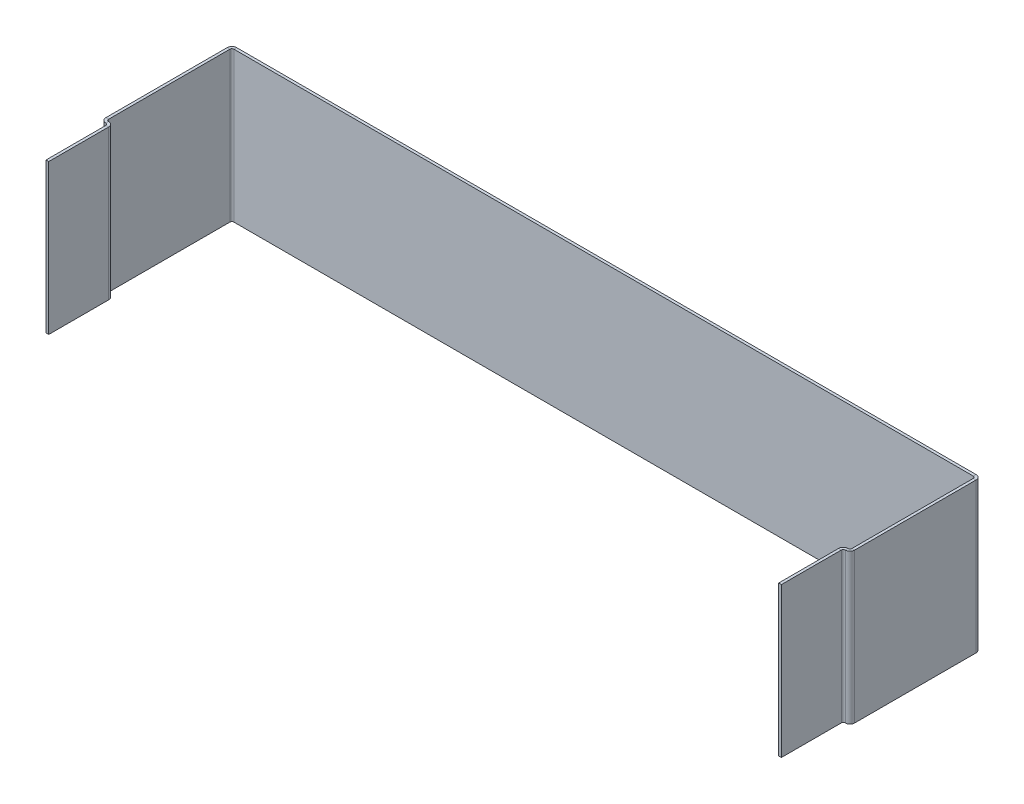
ISO-10303-21;
HEADER;
FILE_DESCRIPTION(('STEP AP214'),'2;1');
FILE_NAME('part.step','',(''),(''),'','','');
FILE_SCHEMA(('AUTOMOTIVE_DESIGN { 1 0 10303 214 1 1 1 1 }'));
ENDSEC;
DATA;
#1=APPLICATION_CONTEXT('core data for automotive mechanical design processes');
#2=APPLICATION_PROTOCOL_DEFINITION('international standard','automotive_design',2000,#1);
#3=PRODUCT_CONTEXT('',#1,'mechanical');
#4=PRODUCT('Part','Part','',(#3));
#5=PRODUCT_RELATED_PRODUCT_CATEGORY('part','',(#4));
#6=PRODUCT_DEFINITION_FORMATION('','',#4);
#7=PRODUCT_DEFINITION_CONTEXT('part definition',#1,'design');
#8=PRODUCT_DEFINITION('design','',#6,#7);
#9=PRODUCT_DEFINITION_SHAPE('','',#8);
#10=(LENGTH_UNIT() NAMED_UNIT(*) SI_UNIT(.MILLI.,.METRE.));
#11=(NAMED_UNIT(*) PLANE_ANGLE_UNIT() SI_UNIT($,.RADIAN.));
#12=(NAMED_UNIT(*) SI_UNIT($,.STERADIAN.) SOLID_ANGLE_UNIT());
#13=UNCERTAINTY_MEASURE_WITH_UNIT(LENGTH_MEASURE(1.E-05),#10,'distance_accuracy_value','');
#14=(GEOMETRIC_REPRESENTATION_CONTEXT(3) GLOBAL_UNCERTAINTY_ASSIGNED_CONTEXT((#13)) GLOBAL_UNIT_ASSIGNED_CONTEXT((#10,
#11,#12)) REPRESENTATION_CONTEXT('',''));
#15=CARTESIAN_POINT('',(0.,0.,0.));
#16=DIRECTION('',(0.,0.,1.));
#17=DIRECTION('',(1.,0.,0.));
#18=AXIS2_PLACEMENT_3D('',#15,#16,#17);
#19=CARTESIAN_POINT('',(-137.5,0.,-4.96023735913067E-13));
#20=DIRECTION('',(1.,0.,0.));
#21=DIRECTION('',(0.,0.,-1.));
#22=AXIS2_PLACEMENT_3D('',#19,#20,#21);
#23=PLANE('',#22);
#24=DIRECTION('',(0.,0.,1.));
#25=VECTOR('',#24,1.);
#26=CARTESIAN_POINT('',(-137.5,-27.5,-4.93287445609877E-13));
#27=LINE('',#26,#25);
#28=CARTESIAN_POINT('',(-137.5,-27.5,0.7366));
#29=VERTEX_POINT('',#28);
#30=CARTESIAN_POINT('',(-137.5,-27.5,45.287854329381));
#31=VERTEX_POINT('',#30);
#32=EDGE_CURVE('E471',#29,#31,#27,.T.);
#33=ORIENTED_EDGE('',*,*,#32,.T.);
#34=DIRECTION('',(0.,1.,0.));
#35=VECTOR('',#34,1.);
#36=CARTESIAN_POINT('',(-137.5,0.,45.287854329381));
#37=LINE('',#36,#35);
#38=CARTESIAN_POINT('',(-137.5,27.4999999999999,45.287854329381));
#39=VERTEX_POINT('',#38);
#40=EDGE_CURVE('E456',#31,#39,#37,.T.);
#41=ORIENTED_EDGE('',*,*,#40,.T.);
#42=DIRECTION('',(0.,0.,-1.));
#43=VECTOR('',#42,1.);
#44=CARTESIAN_POINT('',(-137.5,27.4999999999999,-4.96023735913067E-13));
#45=LINE('',#44,#43);
#46=CARTESIAN_POINT('',(-137.5,27.4999999999999,0.7366));
#47=VERTEX_POINT('',#46);
#48=EDGE_CURVE('E460',#39,#47,#45,.T.);
#49=ORIENTED_EDGE('',*,*,#48,.T.);
#50=DIRECTION('',(0.,-1.,0.));
#51=VECTOR('',#50,1.);
#52=CARTESIAN_POINT('',(-137.5,27.4999999999999,0.7366));
#53=LINE('',#52,#51);
#54=EDGE_CURVE('E436',#29,#47,#53,.F.);
#55=ORIENTED_EDGE('',*,*,#54,.F.);
#56=EDGE_LOOP('',(#33,#41,#49,#55));
#57=FACE_BOUND('',#56,.T.);
#58=ADVANCED_FACE('F63',(#57),#23,.F.);
#59=CARTESIAN_POINT('',(-137.5,-27.5,69.7366));
#60=DIRECTION('',(0.,1.,0.));
#61=DIRECTION('',(0.,0.,1.));
#62=AXIS2_PLACEMENT_3D('',#59,#60,#61);
#63=PLANE('',#62);
#64=DIRECTION('',(0.,0.,-1.));
#65=VECTOR('',#64,1.);
#66=CARTESIAN_POINT('',(-136.5,-27.5,69.7366));
#67=LINE('',#66,#65);
#68=CARTESIAN_POINT('',(-136.5,-27.5,0.736600000000004));
#69=VERTEX_POINT('',#68);
#70=CARTESIAN_POINT('',(-136.5,-27.5,45.287854329381));
#71=VERTEX_POINT('',#70);
#72=EDGE_CURVE('E450',#69,#71,#67,.F.);
#73=ORIENTED_EDGE('',*,*,#72,.T.);
#74=DIRECTION('',(-1.,0.,0.));
#75=VECTOR('',#74,1.);
#76=CARTESIAN_POINT('',(-137.5,-27.5,45.287854329381));
#77=LINE('',#76,#75);
#78=EDGE_CURVE('E459',#71,#31,#77,.T.);
#79=ORIENTED_EDGE('',*,*,#78,.T.);
#80=ORIENTED_EDGE('',*,*,#32,.F.);
#81=DIRECTION('',(1.,0.,0.));
#82=VECTOR('',#81,1.);
#83=CARTESIAN_POINT('',(-136.5,-27.5,0.736600000000004));
#84=LINE('',#83,#82);
#85=EDGE_CURVE('E442',#69,#29,#84,.F.);
#86=ORIENTED_EDGE('',*,*,#85,.F.);
#87=EDGE_LOOP('',(#73,#79,#80,#86));
#88=FACE_BOUND('',#87,.T.);
#89=ADVANCED_FACE('F512',(#88),#63,.F.);
#90=CARTESIAN_POINT('',(-137.5,27.4999999999999,0.));
#91=DIRECTION('',(0.,-1.,0.));
#92=DIRECTION('',(0.,0.,-1.));
#93=AXIS2_PLACEMENT_3D('',#90,#91,#92);
#94=PLANE('',#93);
#95=ORIENTED_EDGE('',*,*,#48,.F.);
#96=DIRECTION('',(1.,0.,0.));
#97=VECTOR('',#96,1.);
#98=CARTESIAN_POINT('',(-137.5,27.4999999999999,45.287854329381));
#99=LINE('',#98,#97);
#100=CARTESIAN_POINT('',(-136.5,27.4999999999999,45.287854329381));
#101=VERTEX_POINT('',#100);
#102=EDGE_CURVE('E464',#39,#101,#99,.T.);
#103=ORIENTED_EDGE('',*,*,#102,.T.);
#104=DIRECTION('',(0.,0.,1.));
#105=VECTOR('',#104,1.);
#106=CARTESIAN_POINT('',(-136.5,27.4999999999999,0.));
#107=LINE('',#106,#105);
#108=CARTESIAN_POINT('',(-136.5,27.4999999999999,0.736600000000004));
#109=VERTEX_POINT('',#108);
#110=EDGE_CURVE('E431',#101,#109,#107,.F.);
#111=ORIENTED_EDGE('',*,*,#110,.T.);
#112=DIRECTION('',(1.,0.,0.));
#113=VECTOR('',#112,1.);
#114=CARTESIAN_POINT('',(-137.5,27.4999999999999,0.7366));
#115=LINE('',#114,#113);
#116=EDGE_CURVE('E447',#109,#47,#115,.F.);
#117=ORIENTED_EDGE('',*,*,#116,.T.);
#118=EDGE_LOOP('',(#95,#103,#111,#117));
#119=FACE_BOUND('',#118,.T.);
#120=ADVANCED_FACE('F519',(#119),#94,.F.);
#121=CARTESIAN_POINT('',(-137.5,-27.5,-1.));
#122=DIRECTION('',(0.,-1.,0.));
#123=DIRECTION('',(1.,0.,0.));
#124=AXIS2_PLACEMENT_3D('',#121,#122,#123);
#125=PLANE('',#124);
#126=DIRECTION('',(1.,0.,0.));
#127=VECTOR('',#126,1.);
#128=CARTESIAN_POINT('',(-137.5,-27.5,0.));
#129=LINE('',#128,#127);
#130=CARTESIAN_POINT('',(-135.7634,-27.5,0.));
#131=VERTEX_POINT('',#130);
#132=CARTESIAN_POINT('',(135.7634,-27.4999999999999,0.));
#133=VERTEX_POINT('',#132);
#134=EDGE_CURVE('E411',#131,#133,#129,.T.);
#135=ORIENTED_EDGE('',*,*,#134,.F.);
#136=DIRECTION('',(0.,0.,-1.));
#137=VECTOR('',#136,1.);
#138=CARTESIAN_POINT('',(-135.7634,-27.5,0.));
#139=LINE('',#138,#137);
#140=CARTESIAN_POINT('',(-135.7634,-27.5,-0.999999999999997));
#141=VERTEX_POINT('',#140);
#142=EDGE_CURVE('E407',#131,#141,#139,.T.);
#143=ORIENTED_EDGE('',*,*,#142,.T.);
#144=DIRECTION('',(1.,0.,0.));
#145=VECTOR('',#144,1.);
#146=CARTESIAN_POINT('',(-137.5,-27.5,-1.));
#147=LINE('',#146,#145);
#148=CARTESIAN_POINT('',(135.7634,-27.4999999999999,-0.999999999999997));
#149=VERTEX_POINT('',#148);
#150=EDGE_CURVE('E418',#141,#149,#147,.T.);
#151=ORIENTED_EDGE('',*,*,#150,.T.);
#152=DIRECTION('',(0.,0.,-1.));
#153=VECTOR('',#152,1.);
#154=CARTESIAN_POINT('',(135.7634,-27.4999999999999,0.));
#155=LINE('',#154,#153);
#156=EDGE_CURVE('E282',#133,#149,#155,.T.);
#157=ORIENTED_EDGE('',*,*,#156,.F.);
#158=EDGE_LOOP('',(#135,#143,#151,#157));
#159=FACE_BOUND('',#158,.T.);
#160=ADVANCED_FACE('F548',(#159),#125,.T.);
#161=CARTESIAN_POINT('',(0.,0.,-1.));
#162=DIRECTION('',(0.,0.,-1.));
#163=DIRECTION('',(-1.,0.,0.));
#164=AXIS2_PLACEMENT_3D('',#161,#162,#163);
#165=PLANE('',#164);
#166=ORIENTED_EDGE('',*,*,#150,.F.);
#167=DIRECTION('',(0.,-1.,0.));
#168=VECTOR('',#167,1.);
#169=CARTESIAN_POINT('',(-135.7634,-27.5,-0.999999999999997));
#170=LINE('',#169,#168);
#171=CARTESIAN_POINT('',(-135.7634,27.4999999999999,-1.));
#172=VERTEX_POINT('',#171);
#173=EDGE_CURVE('E414',#141,#172,#170,.F.);
#174=ORIENTED_EDGE('',*,*,#173,.T.);
#175=DIRECTION('',(-1.,0.,0.));
#176=VECTOR('',#175,1.);
#177=CARTESIAN_POINT('',(-137.5,27.4999999999999,-1.));
#178=LINE('',#177,#176);
#179=CARTESIAN_POINT('',(135.7634,27.5,-1.));
#180=VERTEX_POINT('',#179);
#181=EDGE_CURVE('E417',#180,#172,#178,.T.);
#182=ORIENTED_EDGE('',*,*,#181,.F.);
#183=DIRECTION('',(0.,-1.,0.));
#184=VECTOR('',#183,1.);
#185=CARTESIAN_POINT('',(135.7634,-27.4999999999999,-0.999999999999997));
#186=LINE('',#185,#184);
#187=EDGE_CURVE('E288',#149,#180,#186,.F.);
#188=ORIENTED_EDGE('',*,*,#187,.F.);
#189=EDGE_LOOP('',(#166,#174,#182,#188));
#190=FACE_BOUND('',#189,.T.);
#191=ADVANCED_FACE('F530',(#190),#165,.T.);
#192=CARTESIAN_POINT('',(0.,0.,0.));
#193=DIRECTION('',(0.,0.,-1.));
#194=DIRECTION('',(-1.,0.,0.));
#195=AXIS2_PLACEMENT_3D('',#192,#193,#194);
#196=PLANE('',#195);
#197=DIRECTION('',(0.,-1.,0.));
#198=VECTOR('',#197,1.);
#199=CARTESIAN_POINT('',(-135.7634,-27.5,0.));
#200=LINE('',#199,#198);
#201=CARTESIAN_POINT('',(-135.7634,27.4999999999999,0.));
#202=VERTEX_POINT('',#201);
#203=EDGE_CURVE('E433',#131,#202,#200,.F.);
#204=ORIENTED_EDGE('',*,*,#203,.F.);
#205=ORIENTED_EDGE('',*,*,#134,.T.);
#206=DIRECTION('',(0.,-1.,0.));
#207=VECTOR('',#206,1.);
#208=CARTESIAN_POINT('',(135.7634,-27.4999999999999,0.));
#209=LINE('',#208,#207);
#210=CARTESIAN_POINT('',(135.7634,27.5,0.));
#211=VERTEX_POINT('',#210);
#212=EDGE_CURVE('E298',#133,#211,#209,.F.);
#213=ORIENTED_EDGE('',*,*,#212,.T.);
#214=DIRECTION('',(-1.,0.,0.));
#215=VECTOR('',#214,1.);
#216=CARTESIAN_POINT('',(-137.5,27.4999999999999,0.));
#217=LINE('',#216,#215);
#218=EDGE_CURVE('E413',#211,#202,#217,.T.);
#219=ORIENTED_EDGE('',*,*,#218,.T.);
#220=EDGE_LOOP('',(#204,#205,#213,#219));
#221=FACE_BOUND('',#220,.T.);
#222=ADVANCED_FACE('F557',(#221),#196,.F.);
#223=CARTESIAN_POINT('',(-137.5,27.4999999999999,-1.));
#224=DIRECTION('',(0.,1.,0.));
#225=DIRECTION('',(-1.,0.,0.));
#226=AXIS2_PLACEMENT_3D('',#223,#224,#225);
#227=PLANE('',#226);
#228=DIRECTION('',(0.,0.,-1.));
#229=VECTOR('',#228,1.);
#230=CARTESIAN_POINT('',(-135.7634,27.4999999999999,0.));
#231=LINE('',#230,#229);
#232=EDGE_CURVE('E422',#202,#172,#231,.T.);
#233=ORIENTED_EDGE('',*,*,#232,.F.);
#234=ORIENTED_EDGE('',*,*,#218,.F.);
#235=DIRECTION('',(0.,0.,-1.));
#236=VECTOR('',#235,1.);
#237=CARTESIAN_POINT('',(135.7634,27.5,0.));
#238=LINE('',#237,#236);
#239=EDGE_CURVE('E289',#211,#180,#238,.T.);
#240=ORIENTED_EDGE('',*,*,#239,.T.);
#241=ORIENTED_EDGE('',*,*,#181,.T.);
#242=EDGE_LOOP('',(#233,#234,#240,#241));
#243=FACE_BOUND('',#242,.T.);
#244=ADVANCED_FACE('F533',(#243),#227,.T.);
#245=CARTESIAN_POINT('',(-135.7634,27.4999999999999,0.736600000000006));
#246=DIRECTION('',(0.,1.,0.));
#247=DIRECTION('',(0.,0.,1.));
#248=AXIS2_PLACEMENT_3D('',#245,#246,#247);
#249=PLANE('',#248);
#250=ORIENTED_EDGE('',*,*,#116,.F.);
#251=CARTESIAN_POINT('',(-135.7634,27.4999999999999,0.736600000000006));
#252=DIRECTION('',(0.,-1.,0.));
#253=DIRECTION('',(0.,0.,-1.));
#254=AXIS2_PLACEMENT_3D('',#251,#252,#253);
#255=CIRCLE('',#254,0.736600000000004);
#256=EDGE_CURVE('E435',#202,#109,#255,.F.);
#257=ORIENTED_EDGE('',*,*,#256,.F.);
#258=ORIENTED_EDGE('',*,*,#232,.T.);
#259=CARTESIAN_POINT('',(-135.7634,27.4999999999999,0.736600000000006));
#260=DIRECTION('',(0.,-1.,0.));
#261=DIRECTION('',(0.,0.,-1.));
#262=AXIS2_PLACEMENT_3D('',#259,#260,#261);
#263=CIRCLE('',#262,1.7366);
#264=EDGE_CURVE('E427',#172,#47,#263,.F.);
#265=ORIENTED_EDGE('',*,*,#264,.T.);
#266=EDGE_LOOP('',(#250,#257,#258,#265));
#267=FACE_BOUND('',#266,.T.);
#268=ADVANCED_FACE('F524',(#267),#249,.T.);
#269=CARTESIAN_POINT('',(-135.7634,-27.5,0.736600000000006));
#270=DIRECTION('',(0.,1.,0.));
#271=DIRECTION('',(0.,0.,1.));
#272=AXIS2_PLACEMENT_3D('',#269,#270,#271);
#273=PLANE('',#272);
#274=CARTESIAN_POINT('',(-135.7634,-27.5,0.736600000000006));
#275=DIRECTION('',(0.,-1.,0.));
#276=DIRECTION('',(0.,0.,-1.));
#277=AXIS2_PLACEMENT_3D('',#274,#275,#276);
#278=CIRCLE('',#277,0.736600000000004);
#279=EDGE_CURVE('E428',#69,#131,#278,.T.);
#280=ORIENTED_EDGE('',*,*,#279,.F.);
#281=ORIENTED_EDGE('',*,*,#85,.T.);
#282=CARTESIAN_POINT('',(-135.7634,-27.5,0.736600000000006));
#283=DIRECTION('',(0.,-1.,0.));
#284=DIRECTION('',(0.,0.,-1.));
#285=AXIS2_PLACEMENT_3D('',#282,#283,#284);
#286=CIRCLE('',#285,1.7366);
#287=EDGE_CURVE('E439',#29,#141,#286,.T.);
#288=ORIENTED_EDGE('',*,*,#287,.T.);
#289=ORIENTED_EDGE('',*,*,#142,.F.);
#290=EDGE_LOOP('',(#280,#281,#288,#289));
#291=FACE_BOUND('',#290,.T.);
#292=ADVANCED_FACE('F551',(#291),#273,.F.);
#293=CARTESIAN_POINT('',(-135.7634,-27.5,0.736600000000006));
#294=DIRECTION('',(0.,-1.,0.));
#295=DIRECTION('',(-1.,0.,0.));
#296=AXIS2_PLACEMENT_3D('',#293,#294,#295);
#297=CYLINDRICAL_SURFACE('',#296,1.7366);
#298=ORIENTED_EDGE('',*,*,#173,.F.);
#299=ORIENTED_EDGE('',*,*,#287,.F.);
#300=ORIENTED_EDGE('',*,*,#54,.T.);
#301=ORIENTED_EDGE('',*,*,#264,.F.);
#302=EDGE_LOOP('',(#298,#299,#300,#301));
#303=FACE_BOUND('',#302,.T.);
#304=ADVANCED_FACE('F522',(#303),#297,.T.);
#305=CARTESIAN_POINT('',(-135.7634,-27.5,0.736600000000006));
#306=DIRECTION('',(0.,-1.,0.));
#307=DIRECTION('',(-1.,0.,0.));
#308=AXIS2_PLACEMENT_3D('',#305,#306,#307);
#309=CYLINDRICAL_SURFACE('',#308,0.736600000000004);
#310=ORIENTED_EDGE('',*,*,#203,.T.);
#311=ORIENTED_EDGE('',*,*,#256,.T.);
#312=DIRECTION('',(0.,-1.,0.));
#313=VECTOR('',#312,1.);
#314=CARTESIAN_POINT('',(-136.5,27.4999999999999,0.736600000000004));
#315=LINE('',#314,#313);
#316=EDGE_CURVE('E432',#109,#69,#315,.T.);
#317=ORIENTED_EDGE('',*,*,#316,.T.);
#318=ORIENTED_EDGE('',*,*,#279,.T.);
#319=EDGE_LOOP('',(#310,#311,#317,#318));
#320=FACE_BOUND('',#319,.T.);
#321=ADVANCED_FACE('F554',(#320),#309,.F.);
#322=CARTESIAN_POINT('',(-136.5,0.,-4.92532254574224E-13));
#323=DIRECTION('',(1.,0.,0.));
#324=DIRECTION('',(0.,0.,-1.));
#325=AXIS2_PLACEMENT_3D('',#322,#323,#324);
#326=PLANE('',#325);
#327=DIRECTION('',(0.,1.,0.));
#328=VECTOR('',#327,1.);
#329=CARTESIAN_POINT('',(-136.5,0.,45.287854329381));
#330=LINE('',#329,#328);
#331=EDGE_CURVE('E84',#71,#101,#330,.T.);
#332=ORIENTED_EDGE('',*,*,#331,.F.);
#333=ORIENTED_EDGE('',*,*,#72,.F.);
#334=ORIENTED_EDGE('',*,*,#316,.F.);
#335=ORIENTED_EDGE('',*,*,#110,.F.);
#336=EDGE_LOOP('',(#332,#333,#334,#335));
#337=FACE_BOUND('',#336,.T.);
#338=ADVANCED_FACE('F617',(#337),#326,.T.);
#339=CARTESIAN_POINT('',(-135.7634,-27.5,45.287854329381));
#340=DIRECTION('',(0.,-1.,0.));
#341=DIRECTION('',(0.,0.,-1.));
#342=AXIS2_PLACEMENT_3D('',#339,#340,#341);
#343=PLANE('',#342);
#344=ORIENTED_EDGE('',*,*,#78,.F.);
#345=CARTESIAN_POINT('',(-135.7634,-27.5,45.287854329381));
#346=DIRECTION('',(0.,1.,0.));
#347=DIRECTION('',(0.,0.,1.));
#348=AXIS2_PLACEMENT_3D('',#345,#346,#347);
#349=CIRCLE('',#348,0.7366);
#350=CARTESIAN_POINT('',(-135.7634,-27.5,46.024454329381));
#351=VERTEX_POINT('',#350);
#352=EDGE_CURVE('E396',#71,#351,#349,.T.);
#353=ORIENTED_EDGE('',*,*,#352,.T.);
#354=DIRECTION('',(0.,0.,1.));
#355=VECTOR('',#354,1.);
#356=CARTESIAN_POINT('',(-135.7634,-27.5,47.024454329381));
#357=LINE('',#356,#355);
#358=CARTESIAN_POINT('',(-135.7634,-27.5,47.024454329381));
#359=VERTEX_POINT('',#358);
#360=EDGE_CURVE('E477',#351,#359,#357,.T.);
#361=ORIENTED_EDGE('',*,*,#360,.T.);
#362=CARTESIAN_POINT('',(-135.7634,-27.5,45.287854329381));
#363=DIRECTION('',(0.,1.,0.));
#364=DIRECTION('',(0.,0.,1.));
#365=AXIS2_PLACEMENT_3D('',#362,#363,#364);
#366=CIRCLE('',#365,1.7366);
#367=EDGE_CURVE('E400',#31,#359,#366,.T.);
#368=ORIENTED_EDGE('',*,*,#367,.F.);
#369=EDGE_LOOP('',(#344,#353,#361,#368));
#370=FACE_BOUND('',#369,.T.);
#371=ADVANCED_FACE('F480',(#370),#343,.T.);
#372=CARTESIAN_POINT('',(-135.7634,27.4999999999999,45.287854329381));
#373=DIRECTION('',(0.,1.,0.));
#374=DIRECTION('',(0.,0.,1.));
#375=AXIS2_PLACEMENT_3D('',#372,#373,#374);
#376=PLANE('',#375);
#377=DIRECTION('',(0.,0.,-1.));
#378=VECTOR('',#377,1.);
#379=CARTESIAN_POINT('',(-135.7634,27.4999999999999,47.024454329381));
#380=LINE('',#379,#378);
#381=CARTESIAN_POINT('',(-135.7634,27.4999999999999,47.024454329381));
#382=VERTEX_POINT('',#381);
#383=CARTESIAN_POINT('',(-135.7634,27.4999999999999,46.024454329381));
#384=VERTEX_POINT('',#383);
#385=EDGE_CURVE('E13',#382,#384,#380,.T.);
#386=ORIENTED_EDGE('',*,*,#385,.T.);
#387=CARTESIAN_POINT('',(-135.7634,27.4999999999999,45.287854329381));
#388=DIRECTION('',(0.,1.,0.));
#389=DIRECTION('',(0.,0.,1.));
#390=AXIS2_PLACEMENT_3D('',#387,#388,#389);
#391=CIRCLE('',#390,0.7366);
#392=EDGE_CURVE('E404',#384,#101,#391,.F.);
#393=ORIENTED_EDGE('',*,*,#392,.T.);
#394=ORIENTED_EDGE('',*,*,#102,.F.);
#395=CARTESIAN_POINT('',(-135.7634,27.4999999999999,45.287854329381));
#396=DIRECTION('',(0.,-1.,0.));
#397=DIRECTION('',(0.,0.,-1.));
#398=AXIS2_PLACEMENT_3D('',#395,#396,#397);
#399=CIRCLE('',#398,1.7366);
#400=EDGE_CURVE('E403',#382,#39,#399,.T.);
#401=ORIENTED_EDGE('',*,*,#400,.F.);
#402=EDGE_LOOP('',(#386,#393,#394,#401));
#403=FACE_BOUND('',#402,.T.);
#404=ADVANCED_FACE('F517',(#403),#376,.T.);
#405=CARTESIAN_POINT('',(-135.7634,-55.043374708759,45.287854329381));
#406=DIRECTION('',(0.,1.,0.));
#407=DIRECTION('',(0.,0.,1.));
#408=AXIS2_PLACEMENT_3D('',#405,#406,#407);
#409=CYLINDRICAL_SURFACE('',#408,1.7366);
#410=ORIENTED_EDGE('',*,*,#400,.T.);
#411=ORIENTED_EDGE('',*,*,#40,.F.);
#412=ORIENTED_EDGE('',*,*,#367,.T.);
#413=DIRECTION('',(0.,1.,0.));
#414=VECTOR('',#413,1.);
#415=CARTESIAN_POINT('',(-135.7634,0.,47.024454329381));
#416=LINE('',#415,#414);
#417=EDGE_CURVE('E467',#359,#382,#416,.T.);
#418=ORIENTED_EDGE('',*,*,#417,.T.);
#419=EDGE_LOOP('',(#410,#411,#412,#418));
#420=FACE_BOUND('',#419,.T.);
#421=ADVANCED_FACE('F505',(#420),#409,.T.);
#422=CARTESIAN_POINT('',(-135.7634,-55.043374708759,45.287854329381));
#423=DIRECTION('',(0.,1.,0.));
#424=DIRECTION('',(0.,0.,1.));
#425=AXIS2_PLACEMENT_3D('',#422,#423,#424);
#426=CYLINDRICAL_SURFACE('',#425,0.7366);
#427=ORIENTED_EDGE('',*,*,#392,.F.);
#428=DIRECTION('',(0.,1.,0.));
#429=VECTOR('',#428,1.);
#430=CARTESIAN_POINT('',(-135.7634,0.,46.024454329381));
#431=LINE('',#430,#429);
#432=EDGE_CURVE('E70',#351,#384,#431,.T.);
#433=ORIENTED_EDGE('',*,*,#432,.F.);
#434=ORIENTED_EDGE('',*,*,#352,.F.);
#435=ORIENTED_EDGE('',*,*,#331,.T.);
#436=EDGE_LOOP('',(#427,#433,#434,#435));
#437=FACE_BOUND('',#436,.T.);
#438=ADVANCED_FACE('F514',(#437),#426,.F.);
#439=CARTESIAN_POINT('',(-135.7634,-27.5,47.761054329381));
#440=DIRECTION('',(0.,1.,0.));
#441=DIRECTION('',(0.,0.,1.));
#442=AXIS2_PLACEMENT_3D('',#439,#440,#441);
#443=PLANE('',#442);
#444=ORIENTED_EDGE('',*,*,#360,.F.);
#445=CARTESIAN_POINT('',(-135.7634,-27.5,47.761054329381));
#446=DIRECTION('',(0.,1.,0.));
#447=DIRECTION('',(0.,0.,1.));
#448=AXIS2_PLACEMENT_3D('',#445,#446,#447);
#449=CIRCLE('',#448,1.7366);
#450=CARTESIAN_POINT('',(-134.0268,-27.5,47.761054329381));
#451=VERTEX_POINT('',#450);
#452=EDGE_CURVE('E358',#351,#451,#449,.F.);
#453=ORIENTED_EDGE('',*,*,#452,.T.);
#454=DIRECTION('',(-1.,0.,0.));
#455=VECTOR('',#454,1.);
#456=CARTESIAN_POINT('',(-135.0268,-27.5,47.761054329381));
#457=LINE('',#456,#455);
#458=CARTESIAN_POINT('',(-135.0268,-27.5,47.761054329381));
#459=VERTEX_POINT('',#458);
#460=EDGE_CURVE('E381',#451,#459,#457,.T.);
#461=ORIENTED_EDGE('',*,*,#460,.T.);
#462=CARTESIAN_POINT('',(-135.7634,-27.5,47.761054329381));
#463=DIRECTION('',(0.,-1.,0.));
#464=DIRECTION('',(0.,0.,-1.));
#465=AXIS2_PLACEMENT_3D('',#462,#463,#464);
#466=CIRCLE('',#465,0.7366);
#467=EDGE_CURVE('E389',#359,#459,#466,.T.);
#468=ORIENTED_EDGE('',*,*,#467,.F.);
#469=EDGE_LOOP('',(#444,#453,#461,#468));
#470=FACE_BOUND('',#469,.T.);
#471=ADVANCED_FACE('F483',(#470),#443,.F.);
#472=CARTESIAN_POINT('',(-135.7634,27.4999999999999,47.761054329381));
#473=DIRECTION('',(0.,-1.,0.));
#474=DIRECTION('',(0.,0.,-1.));
#475=AXIS2_PLACEMENT_3D('',#472,#473,#474);
#476=PLANE('',#475);
#477=DIRECTION('',(1.,0.,0.));
#478=VECTOR('',#477,1.);
#479=CARTESIAN_POINT('',(-135.0268,27.4999999999999,47.761054329381));
#480=LINE('',#479,#478);
#481=CARTESIAN_POINT('',(-135.0268,27.4999999999999,47.761054329381));
#482=VERTEX_POINT('',#481);
#483=CARTESIAN_POINT('',(-134.0268,27.4999999999999,47.761054329381));
#484=VERTEX_POINT('',#483);
#485=EDGE_CURVE('E384',#482,#484,#480,.T.);
#486=ORIENTED_EDGE('',*,*,#485,.T.);
#487=CARTESIAN_POINT('',(-135.7634,27.4999999999999,47.761054329381));
#488=DIRECTION('',(0.,1.,0.));
#489=DIRECTION('',(0.,0.,1.));
#490=AXIS2_PLACEMENT_3D('',#487,#488,#489);
#491=CIRCLE('',#490,1.7366);
#492=EDGE_CURVE('E393',#484,#384,#491,.T.);
#493=ORIENTED_EDGE('',*,*,#492,.T.);
#494=ORIENTED_EDGE('',*,*,#385,.F.);
#495=CARTESIAN_POINT('',(-135.7634,27.4999999999999,47.761054329381));
#496=DIRECTION('',(0.,1.,0.));
#497=DIRECTION('',(0.,0.,1.));
#498=AXIS2_PLACEMENT_3D('',#495,#496,#497);
#499=CIRCLE('',#498,0.7366);
#500=EDGE_CURVE('E392',#482,#382,#499,.T.);
#501=ORIENTED_EDGE('',*,*,#500,.F.);
#502=EDGE_LOOP('',(#486,#493,#494,#501));
#503=FACE_BOUND('',#502,.T.);
#504=ADVANCED_FACE('F493',(#503),#476,.F.);
#505=CARTESIAN_POINT('',(-135.7634,-55.043374708759,47.761054329381));
#506=DIRECTION('',(0.,1.,0.));
#507=DIRECTION('',(0.,0.,1.));
#508=AXIS2_PLACEMENT_3D('',#505,#506,#507);
#509=CYLINDRICAL_SURFACE('',#508,0.7366);
#510=ORIENTED_EDGE('',*,*,#500,.T.);
#511=ORIENTED_EDGE('',*,*,#417,.F.);
#512=ORIENTED_EDGE('',*,*,#467,.T.);
#513=DIRECTION('',(0.,1.,0.));
#514=VECTOR('',#513,1.);
#515=CARTESIAN_POINT('',(-135.0268,0.,47.761054329381));
#516=LINE('',#515,#514);
#517=EDGE_CURVE('E355',#459,#482,#516,.T.);
#518=ORIENTED_EDGE('',*,*,#517,.T.);
#519=EDGE_LOOP('',(#510,#511,#512,#518));
#520=FACE_BOUND('',#519,.T.);
#521=ADVANCED_FACE('F502',(#520),#509,.F.);
#522=CARTESIAN_POINT('',(-135.7634,-55.043374708759,47.761054329381));
#523=DIRECTION('',(0.,1.,0.));
#524=DIRECTION('',(0.,0.,1.));
#525=AXIS2_PLACEMENT_3D('',#522,#523,#524);
#526=CYLINDRICAL_SURFACE('',#525,1.7366);
#527=ORIENTED_EDGE('',*,*,#492,.F.);
#528=DIRECTION('',(0.,1.,0.));
#529=VECTOR('',#528,1.);
#530=CARTESIAN_POINT('',(-134.0268,0.,47.761054329381));
#531=LINE('',#530,#529);
#532=EDGE_CURVE('E362',#451,#484,#531,.T.);
#533=ORIENTED_EDGE('',*,*,#532,.F.);
#534=ORIENTED_EDGE('',*,*,#452,.F.);
#535=ORIENTED_EDGE('',*,*,#432,.T.);
#536=EDGE_LOOP('',(#527,#533,#534,#535));
#537=FACE_BOUND('',#536,.T.);
#538=ADVANCED_FACE('F486',(#537),#526,.T.);
#539=CARTESIAN_POINT('',(-135.0268,27.4999999999999,69.7366));
#540=DIRECTION('',(0.,0.,-1.));
#541=DIRECTION('',(-1.,0.,0.));
#542=AXIS2_PLACEMENT_3D('',#539,#540,#541);
#543=PLANE('',#542);
#544=DIRECTION('',(0.,-1.,0.));
#545=VECTOR('',#544,1.);
#546=CARTESIAN_POINT('',(-134.0268,27.4999999999999,69.7366));
#547=LINE('',#546,#545);
#548=CARTESIAN_POINT('',(-134.0268,-27.5,69.7366));
#549=VERTEX_POINT('',#548);
#550=CARTESIAN_POINT('',(-134.0268,27.4999999999999,69.7366));
#551=VERTEX_POINT('',#550);
#552=EDGE_CURVE('E378',#549,#551,#547,.F.);
#553=ORIENTED_EDGE('',*,*,#552,.T.);
#554=DIRECTION('',(1.,0.,0.));
#555=VECTOR('',#554,1.);
#556=CARTESIAN_POINT('',(-135.0268,27.4999999999999,69.7366));
#557=LINE('',#556,#555);
#558=CARTESIAN_POINT('',(-135.0268,27.4999999999999,69.7366));
#559=VERTEX_POINT('',#558);
#560=EDGE_CURVE('E359',#559,#551,#557,.T.);
#561=ORIENTED_EDGE('',*,*,#560,.F.);
#562=DIRECTION('',(0.,1.,0.));
#563=VECTOR('',#562,1.);
#564=CARTESIAN_POINT('',(-135.0268,0.,69.7366));
#565=LINE('',#564,#563);
#566=CARTESIAN_POINT('',(-135.0268,-27.5,69.7366));
#567=VERTEX_POINT('',#566);
#568=EDGE_CURVE('E370',#567,#559,#565,.T.);
#569=ORIENTED_EDGE('',*,*,#568,.F.);
#570=DIRECTION('',(1.,0.,0.));
#571=VECTOR('',#570,1.);
#572=CARTESIAN_POINT('',(-135.0268,-27.5,69.7366));
#573=LINE('',#572,#571);
#574=EDGE_CURVE('E375',#567,#549,#573,.T.);
#575=ORIENTED_EDGE('',*,*,#574,.T.);
#576=EDGE_LOOP('',(#553,#561,#569,#575));
#577=FACE_BOUND('',#576,.T.);
#578=ADVANCED_FACE('F651',(#577),#543,.F.);
#579=CARTESIAN_POINT('',(-135.0268,0.,-1.41169347542963));
#580=DIRECTION('',(1.,0.,0.));
#581=DIRECTION('',(0.,0.,-1.));
#582=AXIS2_PLACEMENT_3D('',#579,#580,#581);
#583=PLANE('',#582);
#584=ORIENTED_EDGE('',*,*,#517,.F.);
#585=DIRECTION('',(0.,0.,1.));
#586=VECTOR('',#585,1.);
#587=CARTESIAN_POINT('',(-135.0268,-27.5,-1.4116934754296));
#588=LINE('',#587,#586);
#589=EDGE_CURVE('E373',#459,#567,#588,.T.);
#590=ORIENTED_EDGE('',*,*,#589,.T.);
#591=ORIENTED_EDGE('',*,*,#568,.T.);
#592=DIRECTION('',(0.,0.,-1.));
#593=VECTOR('',#592,1.);
#594=CARTESIAN_POINT('',(-135.0268,27.4999999999999,-1.41169347542963));
#595=LINE('',#594,#593);
#596=EDGE_CURVE('E367',#559,#482,#595,.T.);
#597=ORIENTED_EDGE('',*,*,#596,.T.);
#598=EDGE_LOOP('',(#584,#590,#591,#597));
#599=FACE_BOUND('',#598,.T.);
#600=ADVANCED_FACE('F497',(#599),#583,.F.);
#601=CARTESIAN_POINT('',(-135.0268,-27.5,68.3249065245708));
#602=DIRECTION('',(0.,1.,0.));
#603=DIRECTION('',(0.,0.,1.));
#604=AXIS2_PLACEMENT_3D('',#601,#602,#603);
#605=PLANE('',#604);
#606=ORIENTED_EDGE('',*,*,#460,.F.);
#607=DIRECTION('',(0.,0.,-1.));
#608=VECTOR('',#607,1.);
#609=CARTESIAN_POINT('',(-134.0268,-27.5,68.3249065245708));
#610=LINE('',#609,#608);
#611=EDGE_CURVE('E365',#451,#549,#610,.F.);
#612=ORIENTED_EDGE('',*,*,#611,.T.);
#613=ORIENTED_EDGE('',*,*,#574,.F.);
#614=ORIENTED_EDGE('',*,*,#589,.F.);
#615=EDGE_LOOP('',(#606,#612,#613,#614));
#616=FACE_BOUND('',#615,.T.);
#617=ADVANCED_FACE('F658',(#616),#605,.F.);
#618=CARTESIAN_POINT('',(-134.0268,0.,-1.41169347542963));
#619=DIRECTION('',(1.,0.,0.));
#620=DIRECTION('',(0.,0.,-1.));
#621=AXIS2_PLACEMENT_3D('',#618,#619,#620);
#622=PLANE('',#621);
#623=ORIENTED_EDGE('',*,*,#611,.F.);
#624=ORIENTED_EDGE('',*,*,#532,.T.);
#625=DIRECTION('',(0.,0.,1.));
#626=VECTOR('',#625,1.);
#627=CARTESIAN_POINT('',(-134.0268,27.4999999999999,-1.41169347542913));
#628=LINE('',#627,#626);
#629=EDGE_CURVE('E356',#551,#484,#628,.F.);
#630=ORIENTED_EDGE('',*,*,#629,.F.);
#631=ORIENTED_EDGE('',*,*,#552,.F.);
#632=EDGE_LOOP('',(#623,#624,#630,#631));
#633=FACE_BOUND('',#632,.T.);
#634=ADVANCED_FACE('F488',(#633),#622,.T.);
#635=CARTESIAN_POINT('',(-135.0268,27.4999999999999,-1.41169347542913));
#636=DIRECTION('',(0.,-1.,0.));
#637=DIRECTION('',(0.,0.,-1.));
#638=AXIS2_PLACEMENT_3D('',#635,#636,#637);
#639=PLANE('',#638);
#640=ORIENTED_EDGE('',*,*,#485,.F.);
#641=ORIENTED_EDGE('',*,*,#596,.F.);
#642=ORIENTED_EDGE('',*,*,#560,.T.);
#643=ORIENTED_EDGE('',*,*,#629,.T.);
#644=EDGE_LOOP('',(#640,#641,#642,#643));
#645=FACE_BOUND('',#644,.T.);
#646=ADVANCED_FACE('F495',(#645),#639,.F.);
#647=CARTESIAN_POINT('',(137.5,0.,-4.96023735913067E-13));
#648=DIRECTION('',(-1.,0.,0.));
#649=DIRECTION('',(0.,0.,-1.));
#650=AXIS2_PLACEMENT_3D('',#647,#648,#649);
#651=PLANE('',#650);
#652=DIRECTION('',(0.,0.,1.));
#653=VECTOR('',#652,1.);
#654=CARTESIAN_POINT('',(137.5,-27.4999999999999,-4.93287445609877E-13));
#655=LINE('',#654,#653);
#656=CARTESIAN_POINT('',(137.5,-27.4999999999999,0.7366));
#657=VERTEX_POINT('',#656);
#658=CARTESIAN_POINT('',(137.5,-27.4999999999999,45.287854329381));
#659=VERTEX_POINT('',#658);
#660=EDGE_CURVE('E339',#657,#659,#655,.T.);
#661=ORIENTED_EDGE('',*,*,#660,.F.);
#662=DIRECTION('',(0.,-1.,0.));
#663=VECTOR('',#662,1.);
#664=CARTESIAN_POINT('',(137.5,27.5,0.7366));
#665=LINE('',#664,#663);
#666=CARTESIAN_POINT('',(137.5,27.5,0.7366));
#667=VERTEX_POINT('',#666);
#668=EDGE_CURVE('E302',#657,#667,#665,.F.);
#669=ORIENTED_EDGE('',*,*,#668,.T.);
#670=DIRECTION('',(0.,0.,-1.));
#671=VECTOR('',#670,1.);
#672=CARTESIAN_POINT('',(137.5,27.5,-4.96023735913067E-13));
#673=LINE('',#672,#671);
#674=CARTESIAN_POINT('',(137.5,27.5,45.287854329381));
#675=VERTEX_POINT('',#674);
#676=EDGE_CURVE('E325',#675,#667,#673,.T.);
#677=ORIENTED_EDGE('',*,*,#676,.F.);
#678=DIRECTION('',(0.,1.,0.));
#679=VECTOR('',#678,1.);
#680=CARTESIAN_POINT('',(137.5,0.,45.287854329381));
#681=LINE('',#680,#679);
#682=EDGE_CURVE('E321',#659,#675,#681,.T.);
#683=ORIENTED_EDGE('',*,*,#682,.F.);
#684=EDGE_LOOP('',(#661,#669,#677,#683));
#685=FACE_BOUND('',#684,.T.);
#686=ADVANCED_FACE('F573',(#685),#651,.F.);
#687=CARTESIAN_POINT('',(137.5,-27.4999999999999,69.7366));
#688=DIRECTION('',(0.,1.,0.));
#689=DIRECTION('',(0.,0.,1.));
#690=AXIS2_PLACEMENT_3D('',#687,#688,#689);
#691=PLANE('',#690);
#692=DIRECTION('',(0.,0.,-1.));
#693=VECTOR('',#692,1.);
#694=CARTESIAN_POINT('',(136.5,-27.4999999999999,69.7366));
#695=LINE('',#694,#693);
#696=CARTESIAN_POINT('',(136.5,-27.4999999999999,0.736600000000004));
#697=VERTEX_POINT('',#696);
#698=CARTESIAN_POINT('',(136.5,-27.4999999999999,45.287854329381));
#699=VERTEX_POINT('',#698);
#700=EDGE_CURVE('E315',#697,#699,#695,.F.);
#701=ORIENTED_EDGE('',*,*,#700,.F.);
#702=DIRECTION('',(-1.,0.,0.));
#703=VECTOR('',#702,1.);
#704=CARTESIAN_POINT('',(136.5,-27.4999999999999,0.736600000000004));
#705=LINE('',#704,#703);
#706=EDGE_CURVE('E308',#697,#657,#705,.F.);
#707=ORIENTED_EDGE('',*,*,#706,.T.);
#708=ORIENTED_EDGE('',*,*,#660,.T.);
#709=DIRECTION('',(1.,0.,0.));
#710=VECTOR('',#709,1.);
#711=CARTESIAN_POINT('',(137.5,-27.4999999999999,45.287854329381));
#712=LINE('',#711,#710);
#713=EDGE_CURVE('E324',#699,#659,#712,.T.);
#714=ORIENTED_EDGE('',*,*,#713,.F.);
#715=EDGE_LOOP('',(#701,#707,#708,#714));
#716=FACE_BOUND('',#715,.T.);
#717=ADVANCED_FACE('F577',(#716),#691,.F.);
#718=CARTESIAN_POINT('',(137.5,27.5,0.));
#719=DIRECTION('',(0.,-1.,0.));
#720=DIRECTION('',(0.,0.,-1.));
#721=AXIS2_PLACEMENT_3D('',#718,#719,#720);
#722=PLANE('',#721);
#723=ORIENTED_EDGE('',*,*,#676,.T.);
#724=DIRECTION('',(-1.,0.,0.));
#725=VECTOR('',#724,1.);
#726=CARTESIAN_POINT('',(137.5,27.5,0.7366));
#727=LINE('',#726,#725);
#728=CARTESIAN_POINT('',(136.5,27.5,0.736600000000004));
#729=VERTEX_POINT('',#728);
#730=EDGE_CURVE('E312',#729,#667,#727,.F.);
#731=ORIENTED_EDGE('',*,*,#730,.F.);
#732=DIRECTION('',(0.,0.,1.));
#733=VECTOR('',#732,1.);
#734=CARTESIAN_POINT('',(136.5,27.5,0.));
#735=LINE('',#734,#733);
#736=CARTESIAN_POINT('',(136.5,27.5,45.287854329381));
#737=VERTEX_POINT('',#736);
#738=EDGE_CURVE('E296',#737,#729,#735,.F.);
#739=ORIENTED_EDGE('',*,*,#738,.F.);
#740=DIRECTION('',(-1.,0.,0.));
#741=VECTOR('',#740,1.);
#742=CARTESIAN_POINT('',(137.5,27.5,45.287854329381));
#743=LINE('',#742,#741);
#744=EDGE_CURVE('E331',#675,#737,#743,.T.);
#745=ORIENTED_EDGE('',*,*,#744,.F.);
#746=EDGE_LOOP('',(#723,#731,#739,#745));
#747=FACE_BOUND('',#746,.T.);
#748=ADVANCED_FACE('F568',(#747),#722,.F.);
#749=CARTESIAN_POINT('',(135.7634,27.5,0.736600000000006));
#750=DIRECTION('',(0.,1.,0.));
#751=DIRECTION('',(0.,0.,1.));
#752=AXIS2_PLACEMENT_3D('',#749,#750,#751);
#753=PLANE('',#752);
#754=ORIENTED_EDGE('',*,*,#730,.T.);
#755=CARTESIAN_POINT('',(135.7634,27.5,0.736600000000006));
#756=DIRECTION('',(0.,1.,0.));
#757=DIRECTION('',(0.,0.,-1.));
#758=AXIS2_PLACEMENT_3D('',#755,#756,#757);
#759=CIRCLE('',#758,1.7366);
#760=EDGE_CURVE('E292',#180,#667,#759,.F.);
#761=ORIENTED_EDGE('',*,*,#760,.F.);
#762=ORIENTED_EDGE('',*,*,#239,.F.);
#763=CARTESIAN_POINT('',(135.7634,27.5,0.736600000000006));
#764=DIRECTION('',(0.,1.,0.));
#765=DIRECTION('',(0.,0.,-1.));
#766=AXIS2_PLACEMENT_3D('',#763,#764,#765);
#767=CIRCLE('',#766,0.736600000000004);
#768=EDGE_CURVE('E301',#211,#729,#767,.F.);
#769=ORIENTED_EDGE('',*,*,#768,.T.);
#770=EDGE_LOOP('',(#754,#761,#762,#769));
#771=FACE_BOUND('',#770,.T.);
#772=ADVANCED_FACE('F560',(#771),#753,.T.);
#773=CARTESIAN_POINT('',(135.7634,-27.4999999999999,0.736600000000006));
#774=DIRECTION('',(0.,1.,0.));
#775=DIRECTION('',(0.,0.,1.));
#776=AXIS2_PLACEMENT_3D('',#773,#774,#775);
#777=PLANE('',#776);
#778=CARTESIAN_POINT('',(135.7634,-27.4999999999999,0.736600000000006));
#779=DIRECTION('',(0.,1.,0.));
#780=DIRECTION('',(0.,0.,-1.));
#781=AXIS2_PLACEMENT_3D('',#778,#779,#780);
#782=CIRCLE('',#781,0.736600000000004);
#783=EDGE_CURVE('E293',#697,#133,#782,.T.);
#784=ORIENTED_EDGE('',*,*,#783,.T.);
#785=ORIENTED_EDGE('',*,*,#156,.T.);
#786=CARTESIAN_POINT('',(135.7634,-27.4999999999999,0.736600000000006));
#787=DIRECTION('',(0.,1.,0.));
#788=DIRECTION('',(0.,0.,-1.));
#789=AXIS2_PLACEMENT_3D('',#786,#787,#788);
#790=CIRCLE('',#789,1.7366);
#791=EDGE_CURVE('E305',#657,#149,#790,.T.);
#792=ORIENTED_EDGE('',*,*,#791,.F.);
#793=ORIENTED_EDGE('',*,*,#706,.F.);
#794=EDGE_LOOP('',(#784,#785,#792,#793));
#795=FACE_BOUND('',#794,.T.);
#796=ADVANCED_FACE('F542',(#795),#777,.F.);
#797=CARTESIAN_POINT('',(135.7634,-27.4999999999999,0.736600000000006));
#798=DIRECTION('',(0.,-1.,0.));
#799=DIRECTION('',(1.,0.,0.));
#800=AXIS2_PLACEMENT_3D('',#797,#798,#799);
#801=CYLINDRICAL_SURFACE('',#800,1.7366);
#802=ORIENTED_EDGE('',*,*,#187,.T.);
#803=ORIENTED_EDGE('',*,*,#760,.T.);
#804=ORIENTED_EDGE('',*,*,#668,.F.);
#805=ORIENTED_EDGE('',*,*,#791,.T.);
#806=EDGE_LOOP('',(#802,#803,#804,#805));
#807=FACE_BOUND('',#806,.T.);
#808=ADVANCED_FACE('F538',(#807),#801,.T.);
#809=CARTESIAN_POINT('',(135.7634,-27.4999999999999,0.736600000000006));
#810=DIRECTION('',(0.,-1.,0.));
#811=DIRECTION('',(1.,0.,0.));
#812=AXIS2_PLACEMENT_3D('',#809,#810,#811);
#813=CYLINDRICAL_SURFACE('',#812,0.736600000000004);
#814=ORIENTED_EDGE('',*,*,#212,.F.);
#815=ORIENTED_EDGE('',*,*,#783,.F.);
#816=DIRECTION('',(0.,-1.,0.));
#817=VECTOR('',#816,1.);
#818=CARTESIAN_POINT('',(136.5,27.5,0.736600000000004));
#819=LINE('',#818,#817);
#820=EDGE_CURVE('E297',#729,#697,#819,.T.);
#821=ORIENTED_EDGE('',*,*,#820,.F.);
#822=ORIENTED_EDGE('',*,*,#768,.F.);
#823=EDGE_LOOP('',(#814,#815,#821,#822));
#824=FACE_BOUND('',#823,.T.);
#825=ADVANCED_FACE('F559',(#824),#813,.F.);
#826=CARTESIAN_POINT('',(136.5,0.,-4.92532254574224E-13));
#827=DIRECTION('',(-1.,0.,0.));
#828=DIRECTION('',(0.,0.,-1.));
#829=AXIS2_PLACEMENT_3D('',#826,#827,#828);
#830=PLANE('',#829);
#831=DIRECTION('',(0.,1.,0.));
#832=VECTOR('',#831,1.);
#833=CARTESIAN_POINT('',(136.5,0.,45.287854329381));
#834=LINE('',#833,#832);
#835=EDGE_CURVE('E328',#699,#737,#834,.T.);
#836=ORIENTED_EDGE('',*,*,#835,.T.);
#837=ORIENTED_EDGE('',*,*,#738,.T.);
#838=ORIENTED_EDGE('',*,*,#820,.T.);
#839=ORIENTED_EDGE('',*,*,#700,.T.);
#840=EDGE_LOOP('',(#836,#837,#838,#839));
#841=FACE_BOUND('',#840,.T.);
#842=ADVANCED_FACE('F564',(#841),#830,.T.);
#843=CARTESIAN_POINT('',(135.7634,-27.4999999999999,45.287854329381));
#844=DIRECTION('',(0.,-1.,0.));
#845=DIRECTION('',(0.,0.,-1.));
#846=AXIS2_PLACEMENT_3D('',#843,#844,#845);
#847=PLANE('',#846);
#848=ORIENTED_EDGE('',*,*,#713,.T.);
#849=CARTESIAN_POINT('',(135.7634,-27.4999999999999,45.287854329381));
#850=DIRECTION('',(0.,-1.,0.));
#851=DIRECTION('',(0.,0.,1.));
#852=AXIS2_PLACEMENT_3D('',#849,#850,#851);
#853=CIRCLE('',#852,1.7366);
#854=CARTESIAN_POINT('',(135.7634,-27.4999999999999,47.024454329381));
#855=VERTEX_POINT('',#854);
#856=EDGE_CURVE('E276',#659,#855,#853,.T.);
#857=ORIENTED_EDGE('',*,*,#856,.T.);
#858=DIRECTION('',(0.,0.,1.));
#859=VECTOR('',#858,1.);
#860=CARTESIAN_POINT('',(135.7634,-27.4999999999999,47.024454329381));
#861=LINE('',#860,#859);
#862=CARTESIAN_POINT('',(135.7634,-27.4999999999999,46.024454329381));
#863=VERTEX_POINT('',#862);
#864=EDGE_CURVE('E346',#863,#855,#861,.T.);
#865=ORIENTED_EDGE('',*,*,#864,.F.);
#866=CARTESIAN_POINT('',(135.7634,-27.4999999999999,45.287854329381));
#867=DIRECTION('',(0.,-1.,0.));
#868=DIRECTION('',(0.,0.,1.));
#869=AXIS2_PLACEMENT_3D('',#866,#867,#868);
#870=CIRCLE('',#869,0.7366);
#871=EDGE_CURVE('E271',#699,#863,#870,.T.);
#872=ORIENTED_EDGE('',*,*,#871,.F.);
#873=EDGE_LOOP('',(#848,#857,#865,#872));
#874=FACE_BOUND('',#873,.T.);
#875=ADVANCED_FACE('F579',(#874),#847,.T.);
#876=CARTESIAN_POINT('',(135.7634,27.5,45.287854329381));
#877=DIRECTION('',(0.,1.,0.));
#878=DIRECTION('',(0.,0.,1.));
#879=AXIS2_PLACEMENT_3D('',#876,#877,#878);
#880=PLANE('',#879);
#881=DIRECTION('',(0.,0.,-1.));
#882=VECTOR('',#881,1.);
#883=CARTESIAN_POINT('',(135.7634,27.5,47.024454329381));
#884=LINE('',#883,#882);
#885=CARTESIAN_POINT('',(135.7634,27.5,47.024454329381));
#886=VERTEX_POINT('',#885);
#887=CARTESIAN_POINT('',(135.7634,27.5,46.024454329381));
#888=VERTEX_POINT('',#887);
#889=EDGE_CURVE('E352',#886,#888,#884,.T.);
#890=ORIENTED_EDGE('',*,*,#889,.F.);
#891=CARTESIAN_POINT('',(135.7634,27.5,45.287854329381));
#892=DIRECTION('',(0.,1.,0.));
#893=DIRECTION('',(0.,0.,-1.));
#894=AXIS2_PLACEMENT_3D('',#891,#892,#893);
#895=CIRCLE('',#894,1.7366);
#896=EDGE_CURVE('E279',#886,#675,#895,.T.);
#897=ORIENTED_EDGE('',*,*,#896,.T.);
#898=ORIENTED_EDGE('',*,*,#744,.T.);
#899=CARTESIAN_POINT('',(135.7634,27.5,45.287854329381));
#900=DIRECTION('',(0.,-1.,0.));
#901=DIRECTION('',(0.,0.,1.));
#902=AXIS2_PLACEMENT_3D('',#899,#900,#901);
#903=CIRCLE('',#902,0.7366);
#904=EDGE_CURVE('E280',#888,#737,#903,.F.);
#905=ORIENTED_EDGE('',*,*,#904,.F.);
#906=EDGE_LOOP('',(#890,#897,#898,#905));
#907=FACE_BOUND('',#906,.T.);
#908=ADVANCED_FACE('F587',(#907),#880,.T.);
#909=CARTESIAN_POINT('',(135.7634,-55.043374708759,45.287854329381));
#910=DIRECTION('',(0.,1.,0.));
#911=DIRECTION('',(0.,0.,1.));
#912=AXIS2_PLACEMENT_3D('',#909,#910,#911);
#913=CYLINDRICAL_SURFACE('',#912,1.7366);
#914=ORIENTED_EDGE('',*,*,#896,.F.);
#915=DIRECTION('',(0.,1.,0.));
#916=VECTOR('',#915,1.);
#917=CARTESIAN_POINT('',(135.7634,0.,47.024454329381));
#918=LINE('',#917,#916);
#919=EDGE_CURVE('E334',#855,#886,#918,.T.);
#920=ORIENTED_EDGE('',*,*,#919,.F.);
#921=ORIENTED_EDGE('',*,*,#856,.F.);
#922=ORIENTED_EDGE('',*,*,#682,.T.);
#923=EDGE_LOOP('',(#914,#920,#921,#922));
#924=FACE_BOUND('',#923,.T.);
#925=ADVANCED_FACE('F597',(#924),#913,.T.);
#926=CARTESIAN_POINT('',(135.7634,-55.043374708759,45.287854329381));
#927=DIRECTION('',(0.,1.,0.));
#928=DIRECTION('',(0.,0.,1.));
#929=AXIS2_PLACEMENT_3D('',#926,#927,#928);
#930=CYLINDRICAL_SURFACE('',#929,0.7366);
#931=ORIENTED_EDGE('',*,*,#904,.T.);
#932=ORIENTED_EDGE('',*,*,#835,.F.);
#933=ORIENTED_EDGE('',*,*,#871,.T.);
#934=DIRECTION('',(0.,1.,0.));
#935=VECTOR('',#934,1.);
#936=CARTESIAN_POINT('',(135.7634,0.,46.024454329381));
#937=LINE('',#936,#935);
#938=EDGE_CURVE('E349',#863,#888,#937,.T.);
#939=ORIENTED_EDGE('',*,*,#938,.T.);
#940=EDGE_LOOP('',(#931,#932,#933,#939));
#941=FACE_BOUND('',#940,.T.);
#942=ADVANCED_FACE('F582',(#941),#930,.F.);
#943=CARTESIAN_POINT('',(135.7634,-27.4999999999999,47.761054329381));
#944=DIRECTION('',(0.,1.,0.));
#945=DIRECTION('',(0.,0.,1.));
#946=AXIS2_PLACEMENT_3D('',#943,#944,#945);
#947=PLANE('',#946);
#948=ORIENTED_EDGE('',*,*,#864,.T.);
#949=CARTESIAN_POINT('',(135.7634,-27.4999999999999,47.761054329381));
#950=DIRECTION('',(0.,1.,0.));
#951=DIRECTION('',(0.,0.,-1.));
#952=AXIS2_PLACEMENT_3D('',#949,#950,#951);
#953=CIRCLE('',#952,0.7366);
#954=CARTESIAN_POINT('',(135.0268,-27.4999999999999,47.761054329381));
#955=VERTEX_POINT('',#954);
#956=EDGE_CURVE('E265',#855,#955,#953,.T.);
#957=ORIENTED_EDGE('',*,*,#956,.T.);
#958=DIRECTION('',(1.,0.,0.));
#959=VECTOR('',#958,1.);
#960=CARTESIAN_POINT('',(135.0268,-27.4999999999999,47.761054329381));
#961=LINE('',#960,#959);
#962=CARTESIAN_POINT('',(134.0268,-27.4999999999999,47.761054329381));
#963=VERTEX_POINT('',#962);
#964=EDGE_CURVE('E259',#963,#955,#961,.T.);
#965=ORIENTED_EDGE('',*,*,#964,.F.);
#966=CARTESIAN_POINT('',(135.7634,-27.4999999999999,47.761054329381));
#967=DIRECTION('',(0.,-1.,0.));
#968=DIRECTION('',(0.,0.,1.));
#969=AXIS2_PLACEMENT_3D('',#966,#967,#968);
#970=CIRCLE('',#969,1.7366);
#971=EDGE_CURVE('E273',#863,#963,#970,.F.);
#972=ORIENTED_EDGE('',*,*,#971,.F.);
#973=EDGE_LOOP('',(#948,#957,#965,#972));
#974=FACE_BOUND('',#973,.T.);
#975=ADVANCED_FACE('F604',(#974),#947,.F.);
#976=CARTESIAN_POINT('',(135.7634,27.5,47.761054329381));
#977=DIRECTION('',(0.,-1.,0.));
#978=DIRECTION('',(0.,0.,-1.));
#979=AXIS2_PLACEMENT_3D('',#976,#977,#978);
#980=PLANE('',#979);
#981=DIRECTION('',(-1.,0.,0.));
#982=VECTOR('',#981,1.);
#983=CARTESIAN_POINT('',(135.0268,27.5,47.761054329381));
#984=LINE('',#983,#982);
#985=CARTESIAN_POINT('',(135.0268,27.5,47.761054329381));
#986=VERTEX_POINT('',#985);
#987=CARTESIAN_POINT('',(134.0268,27.5,47.761054329381));
#988=VERTEX_POINT('',#987);
#989=EDGE_CURVE('E262',#986,#988,#984,.T.);
#990=ORIENTED_EDGE('',*,*,#989,.F.);
#991=CARTESIAN_POINT('',(135.7634,27.5,47.761054329381));
#992=DIRECTION('',(0.,-1.,0.));
#993=DIRECTION('',(0.,0.,1.));
#994=AXIS2_PLACEMENT_3D('',#991,#992,#993);
#995=CIRCLE('',#994,0.7366);
#996=EDGE_CURVE('E268',#986,#886,#995,.T.);
#997=ORIENTED_EDGE('',*,*,#996,.T.);
#998=ORIENTED_EDGE('',*,*,#889,.T.);
#999=CARTESIAN_POINT('',(135.7634,27.5,47.761054329381));
#1000=DIRECTION('',(0.,-1.,0.));
#1001=DIRECTION('',(0.,0.,1.));
#1002=AXIS2_PLACEMENT_3D('',#999,#1000,#1001);
#1003=CIRCLE('',#1002,1.7366);
#1004=EDGE_CURVE('E269',#988,#888,#1003,.T.);
#1005=ORIENTED_EDGE('',*,*,#1004,.F.);
#1006=EDGE_LOOP('',(#990,#997,#998,#1005));
#1007=FACE_BOUND('',#1006,.T.);
#1008=ADVANCED_FACE('F591',(#1007),#980,.F.);
#1009=CARTESIAN_POINT('',(135.7634,-55.043374708759,47.761054329381));
#1010=DIRECTION('',(0.,1.,0.));
#1011=DIRECTION('',(0.,0.,1.));
#1012=AXIS2_PLACEMENT_3D('',#1009,#1010,#1011);
#1013=CYLINDRICAL_SURFACE('',#1012,0.7366);
#1014=ORIENTED_EDGE('',*,*,#996,.F.);
#1015=DIRECTION('',(0.,1.,0.));
#1016=VECTOR('',#1015,1.);
#1017=CARTESIAN_POINT('',(135.0268,0.,47.761054329381));
#1018=LINE('',#1017,#1016);
#1019=EDGE_CURVE('E233',#955,#986,#1018,.T.);
#1020=ORIENTED_EDGE('',*,*,#1019,.F.);
#1021=ORIENTED_EDGE('',*,*,#956,.F.);
#1022=ORIENTED_EDGE('',*,*,#919,.T.);
#1023=EDGE_LOOP('',(#1014,#1020,#1021,#1022));
#1024=FACE_BOUND('',#1023,.T.);
#1025=ADVANCED_FACE('F595',(#1024),#1013,.F.);
#1026=CARTESIAN_POINT('',(135.7634,-55.043374708759,47.761054329381));
#1027=DIRECTION('',(0.,1.,0.));
#1028=DIRECTION('',(0.,0.,1.));
#1029=AXIS2_PLACEMENT_3D('',#1026,#1027,#1028);
#1030=CYLINDRICAL_SURFACE('',#1029,1.7366);
#1031=ORIENTED_EDGE('',*,*,#1004,.T.);
#1032=ORIENTED_EDGE('',*,*,#938,.F.);
#1033=ORIENTED_EDGE('',*,*,#971,.T.);
#1034=DIRECTION('',(0.,1.,0.));
#1035=VECTOR('',#1034,1.);
#1036=CARTESIAN_POINT('',(134.0268,0.,47.761054329381));
#1037=LINE('',#1036,#1035);
#1038=EDGE_CURVE('E246',#963,#988,#1037,.T.);
#1039=ORIENTED_EDGE('',*,*,#1038,.T.);
#1040=EDGE_LOOP('',(#1031,#1032,#1033,#1039));
#1041=FACE_BOUND('',#1040,.T.);
#1042=ADVANCED_FACE('F734',(#1041),#1030,.T.);
#1043=CARTESIAN_POINT('',(135.0268,27.5,69.7366));
#1044=DIRECTION('',(0.,0.,-1.));
#1045=DIRECTION('',(1.,0.,0.));
#1046=AXIS2_PLACEMENT_3D('',#1043,#1044,#1045);
#1047=PLANE('',#1046);
#1048=DIRECTION('',(0.,-1.,0.));
#1049=VECTOR('',#1048,1.);
#1050=CARTESIAN_POINT('',(134.0268,27.5,69.7366));
#1051=LINE('',#1050,#1049);
#1052=CARTESIAN_POINT('',(134.0268,-27.4999999999999,69.7366));
#1053=VERTEX_POINT('',#1052);
#1054=CARTESIAN_POINT('',(134.0268,27.5,69.7366));
#1055=VERTEX_POINT('',#1054);
#1056=EDGE_CURVE('E257',#1053,#1055,#1051,.F.);
#1057=ORIENTED_EDGE('',*,*,#1056,.F.);
#1058=DIRECTION('',(-1.,0.,0.));
#1059=VECTOR('',#1058,1.);
#1060=CARTESIAN_POINT('',(135.0268,-27.4999999999999,69.7366));
#1061=LINE('',#1060,#1059);
#1062=CARTESIAN_POINT('',(135.0268,-27.4999999999999,69.7366));
#1063=VERTEX_POINT('',#1062);
#1064=EDGE_CURVE('E250',#1063,#1053,#1061,.T.);
#1065=ORIENTED_EDGE('',*,*,#1064,.F.);
#1066=DIRECTION('',(0.,1.,0.));
#1067=VECTOR('',#1066,1.);
#1068=CARTESIAN_POINT('',(135.0268,0.,69.7366));
#1069=LINE('',#1068,#1067);
#1070=CARTESIAN_POINT('',(135.0268,27.5,69.7366));
#1071=VERTEX_POINT('',#1070);
#1072=EDGE_CURVE('E230',#1063,#1071,#1069,.T.);
#1073=ORIENTED_EDGE('',*,*,#1072,.T.);
#1074=DIRECTION('',(-1.,0.,0.));
#1075=VECTOR('',#1074,1.);
#1076=CARTESIAN_POINT('',(135.0268,27.5,69.7366));
#1077=LINE('',#1076,#1075);
#1078=EDGE_CURVE('E240',#1071,#1055,#1077,.T.);
#1079=ORIENTED_EDGE('',*,*,#1078,.T.);
#1080=EDGE_LOOP('',(#1057,#1065,#1073,#1079));
#1081=FACE_BOUND('',#1080,.T.);
#1082=ADVANCED_FACE('F248',(#1081),#1047,.F.);
#1083=CARTESIAN_POINT('',(135.0268,0.,-1.41169347542963));
#1084=DIRECTION('',(-1.,0.,0.));
#1085=DIRECTION('',(0.,0.,-1.));
#1086=AXIS2_PLACEMENT_3D('',#1083,#1084,#1085);
#1087=PLANE('',#1086);
#1088=ORIENTED_EDGE('',*,*,#1019,.T.);
#1089=DIRECTION('',(0.,0.,-1.));
#1090=VECTOR('',#1089,1.);
#1091=CARTESIAN_POINT('',(135.0268,27.5,-1.41169347542963));
#1092=LINE('',#1091,#1090);
#1093=EDGE_CURVE('E226',#1071,#986,#1092,.T.);
#1094=ORIENTED_EDGE('',*,*,#1093,.F.);
#1095=ORIENTED_EDGE('',*,*,#1072,.F.);
#1096=DIRECTION('',(0.,0.,1.));
#1097=VECTOR('',#1096,1.);
#1098=CARTESIAN_POINT('',(135.0268,-27.4999999999999,-1.4116934754296));
#1099=LINE('',#1098,#1097);
#1100=EDGE_CURVE('E251',#955,#1063,#1099,.T.);
#1101=ORIENTED_EDGE('',*,*,#1100,.F.);
#1102=EDGE_LOOP('',(#1088,#1094,#1095,#1101));
#1103=FACE_BOUND('',#1102,.T.);
#1104=ADVANCED_FACE('F228',(#1103),#1087,.F.);
#1105=CARTESIAN_POINT('',(135.0268,-27.4999999999999,68.3249065245708));
#1106=DIRECTION('',(0.,1.,0.));
#1107=DIRECTION('',(0.,0.,1.));
#1108=AXIS2_PLACEMENT_3D('',#1105,#1106,#1107);
#1109=PLANE('',#1108);
#1110=ORIENTED_EDGE('',*,*,#964,.T.);
#1111=ORIENTED_EDGE('',*,*,#1100,.T.);
#1112=ORIENTED_EDGE('',*,*,#1064,.T.);
#1113=DIRECTION('',(0.,0.,-1.));
#1114=VECTOR('',#1113,1.);
#1115=CARTESIAN_POINT('',(134.0268,-27.4999999999999,68.3249065245708));
#1116=LINE('',#1115,#1114);
#1117=EDGE_CURVE('E237',#963,#1053,#1116,.F.);
#1118=ORIENTED_EDGE('',*,*,#1117,.F.);
#1119=EDGE_LOOP('',(#1110,#1111,#1112,#1118));
#1120=FACE_BOUND('',#1119,.T.);
#1121=ADVANCED_FACE('F762',(#1120),#1109,.F.);
#1122=CARTESIAN_POINT('',(134.0268,0.,-1.41169347542963));
#1123=DIRECTION('',(-1.,0.,0.));
#1124=DIRECTION('',(0.,0.,-1.));
#1125=AXIS2_PLACEMENT_3D('',#1122,#1123,#1124);
#1126=PLANE('',#1125);
#1127=ORIENTED_EDGE('',*,*,#1117,.T.);
#1128=ORIENTED_EDGE('',*,*,#1056,.T.);
#1129=DIRECTION('',(0.,0.,1.));
#1130=VECTOR('',#1129,1.);
#1131=CARTESIAN_POINT('',(134.0268,27.5,-1.41169347542913));
#1132=LINE('',#1131,#1130);
#1133=EDGE_CURVE('E242',#1055,#988,#1132,.F.);
#1134=ORIENTED_EDGE('',*,*,#1133,.T.);
#1135=ORIENTED_EDGE('',*,*,#1038,.F.);
#1136=EDGE_LOOP('',(#1127,#1128,#1134,#1135));
#1137=FACE_BOUND('',#1136,.T.);
#1138=ADVANCED_FACE('F772',(#1137),#1126,.T.);
#1139=CARTESIAN_POINT('',(135.0268,27.5,-1.41169347542913));
#1140=DIRECTION('',(0.,-1.,0.));
#1141=DIRECTION('',(0.,0.,-1.));
#1142=AXIS2_PLACEMENT_3D('',#1139,#1140,#1141);
#1143=PLANE('',#1142);
#1144=ORIENTED_EDGE('',*,*,#989,.T.);
#1145=ORIENTED_EDGE('',*,*,#1133,.F.);
#1146=ORIENTED_EDGE('',*,*,#1078,.F.);
#1147=ORIENTED_EDGE('',*,*,#1093,.T.);
#1148=EDGE_LOOP('',(#1144,#1145,#1146,#1147));
#1149=FACE_BOUND('',#1148,.T.);
#1150=ADVANCED_FACE('F241',(#1149),#1143,.F.);
#1151=CLOSED_SHELL('',(#58,#89,#120,#160,#191,#222,#244,#268,#292,#304,#321,#338,#371,#404,#421,
#438,#471,#504,#521,#538,#578,#600,#617,#634,#646,#686,#717,#748,#772,#796,#808,#825,#842,#875,
#908,#925,#942,#975,#1008,#1025,#1042,#1082,#1104,#1121,#1138,#1150));
#1152=MANIFOLD_SOLID_BREP('B2',#1151);
#1153=ADVANCED_BREP_SHAPE_REPRESENTATION('',(#18,#1152),#14);
#1154=SHAPE_DEFINITION_REPRESENTATION(#9,#1153);
ENDSEC;
END-ISO-10303-21;
